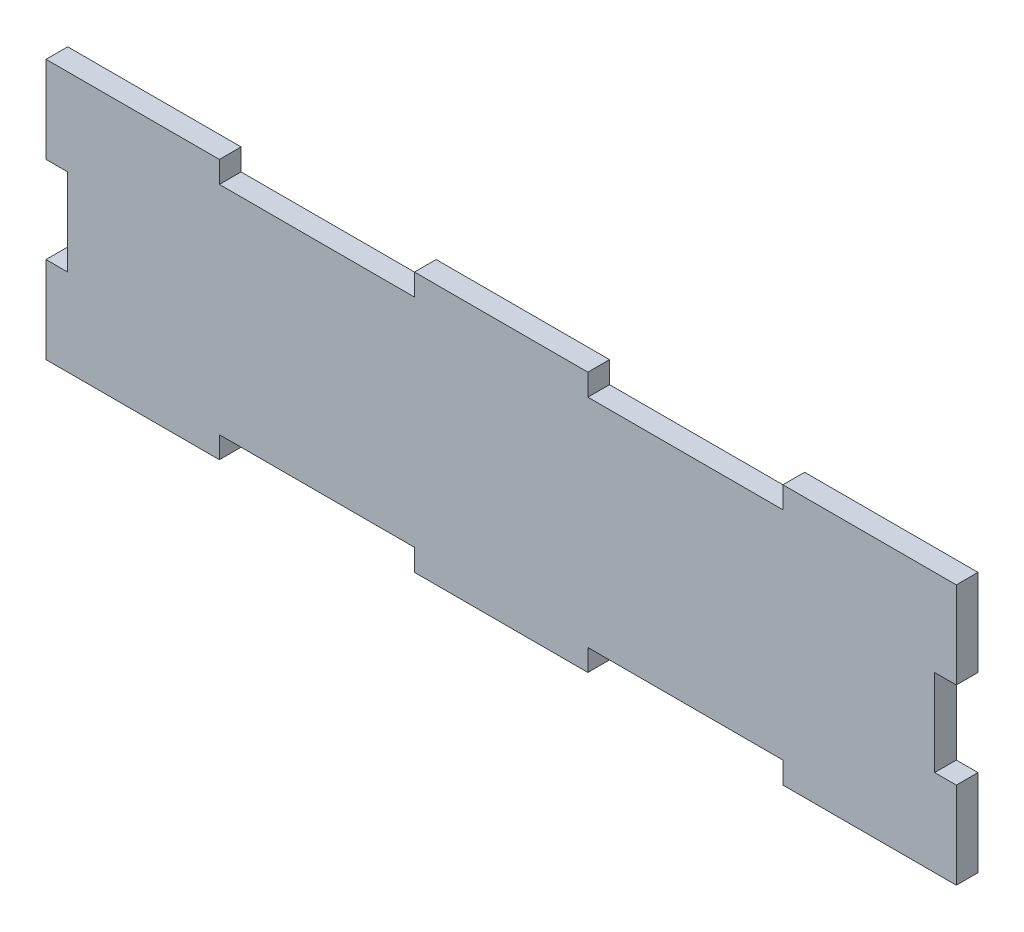
ISO-10303-21;
HEADER;
FILE_DESCRIPTION(('STEP AP214'),'2;1');
FILE_NAME('part.step','',(''),(''),'','','');
FILE_SCHEMA(('AUTOMOTIVE_DESIGN { 1 0 10303 214 1 1 1 1 }'));
ENDSEC;
DATA;
#1=APPLICATION_CONTEXT('core data for automotive mechanical design processes');
#2=APPLICATION_PROTOCOL_DEFINITION('international standard','automotive_design',2000,#1);
#3=PRODUCT_CONTEXT('',#1,'mechanical');
#4=PRODUCT('Part','Part','',(#3));
#5=PRODUCT_RELATED_PRODUCT_CATEGORY('part','',(#4));
#6=PRODUCT_DEFINITION_FORMATION('','',#4);
#7=PRODUCT_DEFINITION_CONTEXT('part definition',#1,'design');
#8=PRODUCT_DEFINITION('design','',#6,#7);
#9=PRODUCT_DEFINITION_SHAPE('','',#8);
#10=(LENGTH_UNIT() NAMED_UNIT(*) SI_UNIT(.MILLI.,.METRE.));
#11=(NAMED_UNIT(*) PLANE_ANGLE_UNIT() SI_UNIT($,.RADIAN.));
#12=(NAMED_UNIT(*) SI_UNIT($,.STERADIAN.) SOLID_ANGLE_UNIT());
#13=UNCERTAINTY_MEASURE_WITH_UNIT(LENGTH_MEASURE(1.E-05),#10,'distance_accuracy_value','');
#14=(GEOMETRIC_REPRESENTATION_CONTEXT(3) GLOBAL_UNCERTAINTY_ASSIGNED_CONTEXT((#13)) GLOBAL_UNIT_ASSIGNED_CONTEXT((#10,
#11,#12)) REPRESENTATION_CONTEXT('',''));
#15=CARTESIAN_POINT('',(0.,0.,0.));
#16=DIRECTION('',(0.,0.,1.));
#17=DIRECTION('',(1.,0.,0.));
#18=AXIS2_PLACEMENT_3D('',#15,#16,#17);
#19=CARTESIAN_POINT('',(133.35,38.1,3.175));
#20=DIRECTION('',(-1.,0.,0.));
#21=DIRECTION('',(0.,0.,1.));
#22=AXIS2_PLACEMENT_3D('',#19,#20,#21);
#23=PLANE('',#22);
#24=DIRECTION('',(0.,1.,0.));
#25=VECTOR('',#24,1.);
#26=CARTESIAN_POINT('',(133.35,38.1,3.175));
#27=LINE('',#26,#25);
#28=CARTESIAN_POINT('',(133.35,12.6999999999459,3.17500000000004));
#29=VERTEX_POINT('',#28);
#30=CARTESIAN_POINT('',(133.35,38.1,3.175));
#31=VERTEX_POINT('',#30);
#32=EDGE_CURVE('E370',#29,#31,#27,.T.);
#33=ORIENTED_EDGE('',*,*,#32,.F.);
#34=DIRECTION('',(0.,0.,-1.));
#35=VECTOR('',#34,1.);
#36=CARTESIAN_POINT('',(133.35,12.699999999946,-3.17499999999996));
#37=LINE('',#36,#35);
#38=CARTESIAN_POINT('',(133.35,12.699999999946,-3.17499999999996));
#39=VERTEX_POINT('',#38);
#40=EDGE_CURVE('E251',#29,#39,#37,.T.);
#41=ORIENTED_EDGE('',*,*,#40,.T.);
#42=DIRECTION('',(0.,1.,0.));
#43=VECTOR('',#42,1.);
#44=CARTESIAN_POINT('',(133.35,38.1,-3.175));
#45=LINE('',#44,#43);
#46=CARTESIAN_POINT('',(133.35,38.1,-3.175));
#47=VERTEX_POINT('',#46);
#48=EDGE_CURVE('E321',#39,#47,#45,.T.);
#49=ORIENTED_EDGE('',*,*,#48,.T.);
#50=DIRECTION('',(0.,0.,-1.));
#51=VECTOR('',#50,1.);
#52=CARTESIAN_POINT('',(133.35,38.1,3.175));
#53=LINE('',#52,#51);
#54=EDGE_CURVE('E406',#31,#47,#53,.T.);
#55=ORIENTED_EDGE('',*,*,#54,.F.);
#56=EDGE_LOOP('',(#33,#41,#49,#55));
#57=FACE_BOUND('',#56,.T.);
#58=ADVANCED_FACE('F36',(#57),#23,.F.);
#59=CARTESIAN_POINT('',(-133.35,38.1,3.175));
#60=DIRECTION('',(1.,0.,0.));
#61=DIRECTION('',(0.,1.,0.));
#62=AXIS2_PLACEMENT_3D('',#59,#60,#61);
#63=PLANE('',#62);
#64=DIRECTION('',(0.,-1.,0.));
#65=VECTOR('',#64,1.);
#66=CARTESIAN_POINT('',(-133.35,38.1,3.175));
#67=LINE('',#66,#65);
#68=CARTESIAN_POINT('',(-133.35,-12.7,3.17499999999928));
#69=VERTEX_POINT('',#68);
#70=CARTESIAN_POINT('',(-133.35,-38.1,3.175));
#71=VERTEX_POINT('',#70);
#72=EDGE_CURVE('E374',#69,#71,#67,.T.);
#73=ORIENTED_EDGE('',*,*,#72,.F.);
#74=DIRECTION('',(0.,0.,-1.));
#75=VECTOR('',#74,1.);
#76=CARTESIAN_POINT('',(-133.35,-12.7,-3.17500000000072));
#77=LINE('',#76,#75);
#78=CARTESIAN_POINT('',(-133.35,-12.7,-3.17500000000072));
#79=VERTEX_POINT('',#78);
#80=EDGE_CURVE('E227',#69,#79,#77,.T.);
#81=ORIENTED_EDGE('',*,*,#80,.T.);
#82=DIRECTION('',(0.,-1.,0.));
#83=VECTOR('',#82,1.);
#84=CARTESIAN_POINT('',(-133.35,38.1,-3.175));
#85=LINE('',#84,#83);
#86=CARTESIAN_POINT('',(-133.35,-38.1,-3.175));
#87=VERTEX_POINT('',#86);
#88=EDGE_CURVE('E389',#79,#87,#85,.T.);
#89=ORIENTED_EDGE('',*,*,#88,.T.);
#90=DIRECTION('',(0.,0.,-1.));
#91=VECTOR('',#90,1.);
#92=CARTESIAN_POINT('',(-133.35,-38.1,3.175));
#93=LINE('',#92,#91);
#94=EDGE_CURVE('E400',#71,#87,#93,.T.);
#95=ORIENTED_EDGE('',*,*,#94,.F.);
#96=EDGE_LOOP('',(#73,#81,#89,#95));
#97=FACE_BOUND('',#96,.T.);
#98=ADVANCED_FACE('F471',(#97),#63,.F.);
#99=CARTESIAN_POINT('',(0.,0.,3.175));
#100=DIRECTION('',(0.,0.,1.));
#101=DIRECTION('',(1.,0.,0.));
#102=AXIS2_PLACEMENT_3D('',#99,#100,#101);
#103=PLANE('',#102);
#104=DIRECTION('',(0.,-1.,0.));
#105=VECTOR('',#104,1.);
#106=CARTESIAN_POINT('',(-127.,12.7,3.17499999999939));
#107=LINE('',#106,#105);
#108=CARTESIAN_POINT('',(-127.,12.7,3.17499999999939));
#109=VERTEX_POINT('',#108);
#110=CARTESIAN_POINT('',(-127.,-12.7,3.1749999999993));
#111=VERTEX_POINT('',#110);
#112=EDGE_CURVE('E226',#109,#111,#107,.T.);
#113=ORIENTED_EDGE('',*,*,#112,.T.);
#114=DIRECTION('',(-1.,0.,0.));
#115=VECTOR('',#114,1.);
#116=CARTESIAN_POINT('',(-127.,-12.7,3.1749999999993));
#117=LINE('',#116,#115);
#118=EDGE_CURVE('E241',#111,#69,#117,.T.);
#119=ORIENTED_EDGE('',*,*,#118,.T.);
#120=ORIENTED_EDGE('',*,*,#72,.T.);
#121=DIRECTION('',(1.,0.,0.));
#122=VECTOR('',#121,1.);
#123=CARTESIAN_POINT('',(-133.35,-38.1,3.175));
#124=LINE('',#123,#122);
#125=CARTESIAN_POINT('',(-82.55,-38.1,3.17500000000013));
#126=VERTEX_POINT('',#125);
#127=EDGE_CURVE('E378',#71,#126,#124,.T.);
#128=ORIENTED_EDGE('',*,*,#127,.T.);
#129=DIRECTION('',(0.,-1.,0.));
#130=VECTOR('',#129,1.);
#131=CARTESIAN_POINT('',(-82.55,-31.75,3.17500000000011));
#132=LINE('',#131,#130);
#133=CARTESIAN_POINT('',(-82.55,-31.75,3.17500000000011));
#134=VERTEX_POINT('',#133);
#135=EDGE_CURVE('E362',#134,#126,#132,.T.);
#136=ORIENTED_EDGE('',*,*,#135,.F.);
#137=DIRECTION('',(-1.,0.,0.));
#138=VECTOR('',#137,1.);
#139=CARTESIAN_POINT('',(0.,-31.75,3.17500000000011));
#140=LINE('',#139,#138);
#141=CARTESIAN_POINT('',(-25.4,-31.75,3.17500000000011));
#142=VERTEX_POINT('',#141);
#143=EDGE_CURVE('E324',#142,#134,#140,.T.);
#144=ORIENTED_EDGE('',*,*,#143,.F.);
#145=DIRECTION('',(0.,-1.,0.));
#146=VECTOR('',#145,1.);
#147=CARTESIAN_POINT('',(-25.4,-31.75,3.17500000000011));
#148=LINE('',#147,#146);
#149=CARTESIAN_POINT('',(-25.4,-38.1,3.17500000000013));
#150=VERTEX_POINT('',#149);
#151=EDGE_CURVE('E359',#142,#150,#148,.T.);
#152=ORIENTED_EDGE('',*,*,#151,.T.);
#153=CARTESIAN_POINT('',(25.4,-38.1,3.17500000000013));
#154=VERTEX_POINT('',#153);
#155=EDGE_CURVE('E382',#150,#154,#124,.T.);
#156=ORIENTED_EDGE('',*,*,#155,.T.);
#157=DIRECTION('',(0.,-1.,0.));
#158=VECTOR('',#157,1.);
#159=CARTESIAN_POINT('',(25.4,-31.75,3.17500000000011));
#160=LINE('',#159,#158);
#161=CARTESIAN_POINT('',(25.4,-31.75,3.17500000000011));
#162=VERTEX_POINT('',#161);
#163=EDGE_CURVE('E352',#162,#154,#160,.T.);
#164=ORIENTED_EDGE('',*,*,#163,.F.);
#165=DIRECTION('',(1.,0.,0.));
#166=VECTOR('',#165,1.);
#167=CARTESIAN_POINT('',(0.,-31.75,3.17500000000011));
#168=LINE('',#167,#166);
#169=CARTESIAN_POINT('',(82.55,-31.75,3.17500000000011));
#170=VERTEX_POINT('',#169);
#171=EDGE_CURVE('E333',#162,#170,#168,.T.);
#172=ORIENTED_EDGE('',*,*,#171,.T.);
#173=DIRECTION('',(0.,-1.,0.));
#174=VECTOR('',#173,1.);
#175=CARTESIAN_POINT('',(82.55,-31.75,3.17500000000011));
#176=LINE('',#175,#174);
#177=CARTESIAN_POINT('',(82.55,-38.1,3.17500000000013));
#178=VERTEX_POINT('',#177);
#179=EDGE_CURVE('E349',#170,#178,#176,.T.);
#180=ORIENTED_EDGE('',*,*,#179,.T.);
#181=CARTESIAN_POINT('',(133.35,-38.1,3.175));
#182=VERTEX_POINT('',#181);
#183=EDGE_CURVE('E377',#178,#182,#124,.T.);
#184=ORIENTED_EDGE('',*,*,#183,.T.);
#185=CARTESIAN_POINT('',(133.35,-12.7000000000541,3.17499999999996));
#186=VERTEX_POINT('',#185);
#187=EDGE_CURVE('E366',#182,#186,#27,.T.);
#188=ORIENTED_EDGE('',*,*,#187,.T.);
#189=DIRECTION('',(1.,0.,0.));
#190=VECTOR('',#189,1.);
#191=CARTESIAN_POINT('',(127.,-12.700000000054,3.17499999999996));
#192=LINE('',#191,#190);
#193=CARTESIAN_POINT('',(127.,-12.700000000054,3.17499999999996));
#194=VERTEX_POINT('',#193);
#195=EDGE_CURVE('E267',#194,#186,#192,.T.);
#196=ORIENTED_EDGE('',*,*,#195,.F.);
#197=DIRECTION('',(0.,1.,0.));
#198=VECTOR('',#197,1.);
#199=CARTESIAN_POINT('',(127.,-12.700000000054,3.17499999999996));
#200=LINE('',#199,#198);
#201=CARTESIAN_POINT('',(127.,12.699999999946,3.17500000000004));
#202=VERTEX_POINT('',#201);
#203=EDGE_CURVE('E250',#194,#202,#200,.T.);
#204=ORIENTED_EDGE('',*,*,#203,.T.);
#205=DIRECTION('',(1.,0.,0.));
#206=VECTOR('',#205,1.);
#207=CARTESIAN_POINT('',(127.,12.699999999946,3.17500000000004));
#208=LINE('',#207,#206);
#209=EDGE_CURVE('E264',#202,#29,#208,.T.);
#210=ORIENTED_EDGE('',*,*,#209,.T.);
#211=ORIENTED_EDGE('',*,*,#32,.T.);
#212=DIRECTION('',(-1.,0.,0.));
#213=VECTOR('',#212,1.);
#214=CARTESIAN_POINT('',(-133.35,38.1,3.175));
#215=LINE('',#214,#213);
#216=CARTESIAN_POINT('',(82.55,38.1,3.17500000000013));
#217=VERTEX_POINT('',#216);
#218=EDGE_CURVE('E371',#31,#217,#215,.T.);
#219=ORIENTED_EDGE('',*,*,#218,.T.);
#220=DIRECTION('',(0.,-1.,0.));
#221=VECTOR('',#220,1.);
#222=CARTESIAN_POINT('',(82.55,38.1,3.17500000000013));
#223=LINE('',#222,#221);
#224=CARTESIAN_POINT('',(82.55,31.75,3.17500000000011));
#225=VERTEX_POINT('',#224);
#226=EDGE_CURVE('E303',#217,#225,#223,.T.);
#227=ORIENTED_EDGE('',*,*,#226,.T.);
#228=DIRECTION('',(1.,0.,0.));
#229=VECTOR('',#228,1.);
#230=CARTESIAN_POINT('',(0.,31.75,3.17500000000011));
#231=LINE('',#230,#229);
#232=CARTESIAN_POINT('',(25.4,31.75,3.17500000000011));
#233=VERTEX_POINT('',#232);
#234=EDGE_CURVE('E298',#233,#225,#231,.T.);
#235=ORIENTED_EDGE('',*,*,#234,.F.);
#236=DIRECTION('',(0.,-1.,0.));
#237=VECTOR('',#236,1.);
#238=CARTESIAN_POINT('',(25.4,38.1,3.17500000000013));
#239=LINE('',#238,#237);
#240=CARTESIAN_POINT('',(25.4,38.1,3.17500000000013));
#241=VERTEX_POINT('',#240);
#242=EDGE_CURVE('E306',#241,#233,#239,.T.);
#243=ORIENTED_EDGE('',*,*,#242,.F.);
#244=CARTESIAN_POINT('',(-25.4,38.1,3.17500000000013));
#245=VERTEX_POINT('',#244);
#246=EDGE_CURVE('E375',#241,#245,#215,.T.);
#247=ORIENTED_EDGE('',*,*,#246,.T.);
#248=DIRECTION('',(0.,-1.,0.));
#249=VECTOR('',#248,1.);
#250=CARTESIAN_POINT('',(-25.4,38.1,3.17500000000013));
#251=LINE('',#250,#249);
#252=CARTESIAN_POINT('',(-25.4,31.75,3.17500000000011));
#253=VERTEX_POINT('',#252);
#254=EDGE_CURVE('E313',#245,#253,#251,.T.);
#255=ORIENTED_EDGE('',*,*,#254,.T.);
#256=DIRECTION('',(-1.,0.,0.));
#257=VECTOR('',#256,1.);
#258=CARTESIAN_POINT('',(0.,31.75,3.17500000000011));
#259=LINE('',#258,#257);
#260=CARTESIAN_POINT('',(-82.55,31.75,3.17500000000011));
#261=VERTEX_POINT('',#260);
#262=EDGE_CURVE('E288',#253,#261,#259,.T.);
#263=ORIENTED_EDGE('',*,*,#262,.T.);
#264=DIRECTION('',(0.,-1.,0.));
#265=VECTOR('',#264,1.);
#266=CARTESIAN_POINT('',(-82.55,38.1,3.17500000000013));
#267=LINE('',#266,#265);
#268=CARTESIAN_POINT('',(-82.55,38.1,3.17500000000013));
#269=VERTEX_POINT('',#268);
#270=EDGE_CURVE('E316',#269,#261,#267,.T.);
#271=ORIENTED_EDGE('',*,*,#270,.F.);
#272=CARTESIAN_POINT('',(-133.35,38.1,3.175));
#273=VERTEX_POINT('',#272);
#274=EDGE_CURVE('E369',#269,#273,#215,.T.);
#275=ORIENTED_EDGE('',*,*,#274,.T.);
#276=CARTESIAN_POINT('',(-133.35,12.7,3.17499999999936));
#277=VERTEX_POINT('',#276);
#278=EDGE_CURVE('E240',#273,#277,#67,.T.);
#279=ORIENTED_EDGE('',*,*,#278,.T.);
#280=DIRECTION('',(-1.,0.,0.));
#281=VECTOR('',#280,1.);
#282=CARTESIAN_POINT('',(-127.,12.7,3.17499999999939));
#283=LINE('',#282,#281);
#284=EDGE_CURVE('E221',#109,#277,#283,.T.);
#285=ORIENTED_EDGE('',*,*,#284,.F.);
#286=EDGE_LOOP('',(#113,#119,#120,#128,#136,#144,#152,#156,#164,#172,#180,#184,#188,#196,#204,
#210,#211,#219,#227,#235,#243,#247,#255,#263,#271,#275,#279,#285));
#287=FACE_BOUND('',#286,.T.);
#288=ADVANCED_FACE('F238',(#287),#103,.T.);
#289=CARTESIAN_POINT('',(-133.35,38.1,3.175));
#290=DIRECTION('',(0.,-1.,0.));
#291=DIRECTION('',(0.,0.,-1.));
#292=AXIS2_PLACEMENT_3D('',#289,#290,#291);
#293=PLANE('',#292);
#294=DIRECTION('',(0.,0.,-1.));
#295=VECTOR('',#294,1.);
#296=CARTESIAN_POINT('',(-25.4,38.1,-6.34999999999987));
#297=LINE('',#296,#295);
#298=CARTESIAN_POINT('',(-25.4,38.1,-3.17499999999987));
#299=VERTEX_POINT('',#298);
#300=EDGE_CURVE('E276',#245,#299,#297,.T.);
#301=ORIENTED_EDGE('',*,*,#300,.F.);
#302=ORIENTED_EDGE('',*,*,#246,.F.);
#303=DIRECTION('',(0.,0.,-1.));
#304=VECTOR('',#303,1.);
#305=CARTESIAN_POINT('',(25.4,38.1,-6.34999999999987));
#306=LINE('',#305,#304);
#307=CARTESIAN_POINT('',(25.4,38.1,-3.17499999999987));
#308=VERTEX_POINT('',#307);
#309=EDGE_CURVE('E279',#241,#308,#306,.T.);
#310=ORIENTED_EDGE('',*,*,#309,.T.);
#311=DIRECTION('',(-1.,0.,0.));
#312=VECTOR('',#311,1.);
#313=CARTESIAN_POINT('',(-133.35,38.1,-3.175));
#314=LINE('',#313,#312);
#315=EDGE_CURVE('E390',#308,#299,#314,.T.);
#316=ORIENTED_EDGE('',*,*,#315,.T.);
#317=EDGE_LOOP('',(#301,#302,#310,#316));
#318=FACE_BOUND('',#317,.T.);
#319=ADVANCED_FACE('F486',(#318),#293,.F.);
#320=DIRECTION('',(0.,0.,-1.));
#321=VECTOR('',#320,1.);
#322=CARTESIAN_POINT('',(82.55,38.1,-6.34999999999987));
#323=LINE('',#322,#321);
#324=CARTESIAN_POINT('',(82.55,38.1,-3.17499999999986));
#325=VERTEX_POINT('',#324);
#326=EDGE_CURVE('E282',#217,#325,#323,.T.);
#327=ORIENTED_EDGE('',*,*,#326,.F.);
#328=ORIENTED_EDGE('',*,*,#218,.F.);
#329=ORIENTED_EDGE('',*,*,#54,.T.);
#330=EDGE_CURVE('E386',#47,#325,#314,.T.);
#331=ORIENTED_EDGE('',*,*,#330,.T.);
#332=EDGE_LOOP('',(#327,#328,#329,#331));
#333=FACE_BOUND('',#332,.T.);
#334=ADVANCED_FACE('F473',(#333),#293,.F.);
#335=CARTESIAN_POINT('',(-133.35,-38.1,3.175));
#336=DIRECTION('',(0.,1.,0.));
#337=DIRECTION('',(0.,0.,1.));
#338=AXIS2_PLACEMENT_3D('',#335,#336,#337);
#339=PLANE('',#338);
#340=DIRECTION('',(0.,0.,-1.));
#341=VECTOR('',#340,1.);
#342=CARTESIAN_POINT('',(25.4,-38.1,-6.34999999999987));
#343=LINE('',#342,#341);
#344=CARTESIAN_POINT('',(25.4,-38.1,-3.17499999999987));
#345=VERTEX_POINT('',#344);
#346=EDGE_CURVE('E344',#154,#345,#343,.T.);
#347=ORIENTED_EDGE('',*,*,#346,.F.);
#348=ORIENTED_EDGE('',*,*,#155,.F.);
#349=DIRECTION('',(0.,0.,-1.));
#350=VECTOR('',#349,1.);
#351=CARTESIAN_POINT('',(-25.4,-38.1,-6.34999999999987));
#352=LINE('',#351,#350);
#353=CARTESIAN_POINT('',(-25.4,-38.1,-3.17499999999987));
#354=VERTEX_POINT('',#353);
#355=EDGE_CURVE('E341',#150,#354,#352,.T.);
#356=ORIENTED_EDGE('',*,*,#355,.T.);
#357=DIRECTION('',(1.,0.,0.));
#358=VECTOR('',#357,1.);
#359=CARTESIAN_POINT('',(-133.35,-38.1,-3.175));
#360=LINE('',#359,#358);
#361=EDGE_CURVE('E397',#354,#345,#360,.T.);
#362=ORIENTED_EDGE('',*,*,#361,.T.);
#363=EDGE_LOOP('',(#347,#348,#356,#362));
#364=FACE_BOUND('',#363,.T.);
#365=ADVANCED_FACE('F445',(#364),#339,.F.);
#366=DIRECTION('',(0.,0.,-1.));
#367=VECTOR('',#366,1.);
#368=CARTESIAN_POINT('',(-82.55,-38.1,-6.34999999999987));
#369=LINE('',#368,#367);
#370=CARTESIAN_POINT('',(-82.55,-38.1,-3.17499999999986));
#371=VERTEX_POINT('',#370);
#372=EDGE_CURVE('E243',#126,#371,#369,.T.);
#373=ORIENTED_EDGE('',*,*,#372,.F.);
#374=ORIENTED_EDGE('',*,*,#127,.F.);
#375=ORIENTED_EDGE('',*,*,#94,.T.);
#376=EDGE_CURVE('E394',#87,#371,#360,.T.);
#377=ORIENTED_EDGE('',*,*,#376,.T.);
#378=EDGE_LOOP('',(#373,#374,#375,#377));
#379=FACE_BOUND('',#378,.T.);
#380=ADVANCED_FACE('F461',(#379),#339,.F.);
#381=CARTESIAN_POINT('',(133.35,-38.1,-3.175));
#382=VERTEX_POINT('',#381);
#383=CARTESIAN_POINT('',(133.35,-12.700000000054,-3.17500000000004));
#384=VERTEX_POINT('',#383);
#385=EDGE_CURVE('E383',#382,#384,#45,.T.);
#386=ORIENTED_EDGE('',*,*,#385,.T.);
#387=DIRECTION('',(0.,0.,1.));
#388=VECTOR('',#387,1.);
#389=CARTESIAN_POINT('',(133.35,-12.700000000054,-3.17500000000004));
#390=LINE('',#389,#388);
#391=EDGE_CURVE('E258',#384,#186,#390,.T.);
#392=ORIENTED_EDGE('',*,*,#391,.T.);
#393=ORIENTED_EDGE('',*,*,#187,.F.);
#394=DIRECTION('',(0.,0.,-1.));
#395=VECTOR('',#394,1.);
#396=CARTESIAN_POINT('',(133.35,-38.1,3.175));
#397=LINE('',#396,#395);
#398=EDGE_CURVE('E381',#182,#382,#397,.T.);
#399=ORIENTED_EDGE('',*,*,#398,.T.);
#400=EDGE_LOOP('',(#386,#392,#393,#399));
#401=FACE_BOUND('',#400,.T.);
#402=ADVANCED_FACE('F38',(#401),#23,.F.);
#403=ORIENTED_EDGE('',*,*,#274,.F.);
#404=DIRECTION('',(0.,0.,-1.));
#405=VECTOR('',#404,1.);
#406=CARTESIAN_POINT('',(-82.55,38.1,-6.34999999999987));
#407=LINE('',#406,#405);
#408=CARTESIAN_POINT('',(-82.55,38.1,-3.17499999999986));
#409=VERTEX_POINT('',#408);
#410=EDGE_CURVE('E273',#269,#409,#407,.T.);
#411=ORIENTED_EDGE('',*,*,#410,.T.);
#412=CARTESIAN_POINT('',(-133.35,38.1,-3.175));
#413=VERTEX_POINT('',#412);
#414=EDGE_CURVE('E385',#409,#413,#314,.T.);
#415=ORIENTED_EDGE('',*,*,#414,.T.);
#416=DIRECTION('',(0.,0.,-1.));
#417=VECTOR('',#416,1.);
#418=CARTESIAN_POINT('',(-133.35,38.1,3.175));
#419=LINE('',#418,#417);
#420=EDGE_CURVE('E403',#273,#413,#419,.T.);
#421=ORIENTED_EDGE('',*,*,#420,.F.);
#422=EDGE_LOOP('',(#403,#411,#415,#421));
#423=FACE_BOUND('',#422,.T.);
#424=ADVANCED_FACE('F468',(#423),#293,.F.);
#425=CARTESIAN_POINT('',(-133.35,12.7,-3.17500000000064));
#426=VERTEX_POINT('',#425);
#427=EDGE_CURVE('E391',#413,#426,#85,.T.);
#428=ORIENTED_EDGE('',*,*,#427,.T.);
#429=DIRECTION('',(0.,0.,1.));
#430=VECTOR('',#429,1.);
#431=CARTESIAN_POINT('',(-133.35,12.7,-3.17500000000064));
#432=LINE('',#431,#430);
#433=EDGE_CURVE('E272',#426,#277,#432,.T.);
#434=ORIENTED_EDGE('',*,*,#433,.T.);
#435=ORIENTED_EDGE('',*,*,#278,.F.);
#436=ORIENTED_EDGE('',*,*,#420,.T.);
#437=EDGE_LOOP('',(#428,#434,#435,#436));
#438=FACE_BOUND('',#437,.T.);
#439=ADVANCED_FACE('F459',(#438),#63,.F.);
#440=ORIENTED_EDGE('',*,*,#183,.F.);
#441=DIRECTION('',(0.,0.,-1.));
#442=VECTOR('',#441,1.);
#443=CARTESIAN_POINT('',(82.55,-38.1,-6.34999999999987));
#444=LINE('',#443,#442);
#445=CARTESIAN_POINT('',(82.55,-38.1,-3.17499999999986));
#446=VERTEX_POINT('',#445);
#447=EDGE_CURVE('E325',#178,#446,#444,.T.);
#448=ORIENTED_EDGE('',*,*,#447,.T.);
#449=EDGE_CURVE('E393',#446,#382,#360,.T.);
#450=ORIENTED_EDGE('',*,*,#449,.T.);
#451=ORIENTED_EDGE('',*,*,#398,.F.);
#452=EDGE_LOOP('',(#440,#448,#450,#451));
#453=FACE_BOUND('',#452,.T.);
#454=ADVANCED_FACE('F457',(#453),#339,.F.);
#455=CARTESIAN_POINT('',(0.,0.,-3.175));
#456=DIRECTION('',(0.,0.,1.));
#457=DIRECTION('',(1.,0.,0.));
#458=AXIS2_PLACEMENT_3D('',#455,#456,#457);
#459=PLANE('',#458);
#460=DIRECTION('',(-1.,0.,0.));
#461=VECTOR('',#460,1.);
#462=CARTESIAN_POINT('',(-127.,12.7,-3.17500000000061));
#463=LINE('',#462,#461);
#464=CARTESIAN_POINT('',(-127.,12.7,-3.175));
#465=VERTEX_POINT('',#464);
#466=EDGE_CURVE('E224',#465,#426,#463,.T.);
#467=ORIENTED_EDGE('',*,*,#466,.T.);
#468=ORIENTED_EDGE('',*,*,#427,.F.);
#469=ORIENTED_EDGE('',*,*,#414,.F.);
#470=DIRECTION('',(0.,-1.,0.));
#471=VECTOR('',#470,1.);
#472=CARTESIAN_POINT('',(-82.55,38.1,-3.17499999999986));
#473=LINE('',#472,#471);
#474=CARTESIAN_POINT('',(-82.55,31.75,-3.17499999999988));
#475=VERTEX_POINT('',#474);
#476=EDGE_CURVE('E318',#409,#475,#473,.T.);
#477=ORIENTED_EDGE('',*,*,#476,.T.);
#478=DIRECTION('',(-1.,0.,0.));
#479=VECTOR('',#478,1.);
#480=CARTESIAN_POINT('',(0.,31.75,-3.175));
#481=LINE('',#480,#479);
#482=CARTESIAN_POINT('',(-25.4,31.75,-3.175));
#483=VERTEX_POINT('',#482);
#484=EDGE_CURVE('E413',#483,#475,#481,.T.);
#485=ORIENTED_EDGE('',*,*,#484,.F.);
#486=DIRECTION('',(0.,-1.,0.));
#487=VECTOR('',#486,1.);
#488=CARTESIAN_POINT('',(-25.4,38.1,-3.17499999999987));
#489=LINE('',#488,#487);
#490=EDGE_CURVE('E311',#299,#483,#489,.T.);
#491=ORIENTED_EDGE('',*,*,#490,.F.);
#492=ORIENTED_EDGE('',*,*,#315,.F.);
#493=DIRECTION('',(0.,-1.,0.));
#494=VECTOR('',#493,1.);
#495=CARTESIAN_POINT('',(25.4,38.1,-3.17499999999987));
#496=LINE('',#495,#494);
#497=CARTESIAN_POINT('',(25.4,31.75,-3.17499999999989));
#498=VERTEX_POINT('',#497);
#499=EDGE_CURVE('E308',#308,#498,#496,.T.);
#500=ORIENTED_EDGE('',*,*,#499,.T.);
#501=CARTESIAN_POINT('',(82.55,31.75,-3.175));
#502=VERTEX_POINT('',#501);
#503=EDGE_CURVE('E414',#502,#498,#481,.T.);
#504=ORIENTED_EDGE('',*,*,#503,.F.);
#505=DIRECTION('',(0.,-1.,0.));
#506=VECTOR('',#505,1.);
#507=CARTESIAN_POINT('',(82.55,38.1,-3.17499999999986));
#508=LINE('',#507,#506);
#509=EDGE_CURVE('E284',#325,#502,#508,.T.);
#510=ORIENTED_EDGE('',*,*,#509,.F.);
#511=ORIENTED_EDGE('',*,*,#330,.F.);
#512=ORIENTED_EDGE('',*,*,#48,.F.);
#513=DIRECTION('',(1.,0.,0.));
#514=VECTOR('',#513,1.);
#515=CARTESIAN_POINT('',(127.,12.699999999946,-3.17499999999996));
#516=LINE('',#515,#514);
#517=CARTESIAN_POINT('',(127.,12.699999999946,-3.17499999999996));
#518=VERTEX_POINT('',#517);
#519=EDGE_CURVE('E257',#518,#39,#516,.T.);
#520=ORIENTED_EDGE('',*,*,#519,.F.);
#521=DIRECTION('',(0.,1.,0.));
#522=VECTOR('',#521,1.);
#523=CARTESIAN_POINT('',(127.,-1.33025439009923E-12,-3.175));
#524=LINE('',#523,#522);
#525=CARTESIAN_POINT('',(127.,-12.700000000054,-3.175));
#526=VERTEX_POINT('',#525);
#527=EDGE_CURVE('E44',#526,#518,#524,.T.);
#528=ORIENTED_EDGE('',*,*,#527,.F.);
#529=DIRECTION('',(1.,0.,0.));
#530=VECTOR('',#529,1.);
#531=CARTESIAN_POINT('',(127.,-12.700000000054,-3.17500000000004));
#532=LINE('',#531,#530);
#533=EDGE_CURVE('E269',#526,#384,#532,.T.);
#534=ORIENTED_EDGE('',*,*,#533,.T.);
#535=ORIENTED_EDGE('',*,*,#385,.F.);
#536=ORIENTED_EDGE('',*,*,#449,.F.);
#537=DIRECTION('',(0.,-1.,0.));
#538=VECTOR('',#537,1.);
#539=CARTESIAN_POINT('',(82.55,-31.75,-3.17499999999988));
#540=LINE('',#539,#538);
#541=CARTESIAN_POINT('',(82.55,-31.75,-3.17499999999988));
#542=VERTEX_POINT('',#541);
#543=EDGE_CURVE('E339',#542,#446,#540,.T.);
#544=ORIENTED_EDGE('',*,*,#543,.F.);
#545=DIRECTION('',(-1.,0.,0.));
#546=VECTOR('',#545,1.);
#547=CARTESIAN_POINT('',(0.,-31.75,-3.175));
#548=LINE('',#547,#546);
#549=CARTESIAN_POINT('',(25.4,-31.75,-3.175));
#550=VERTEX_POINT('',#549);
#551=EDGE_CURVE('E410',#542,#550,#548,.T.);
#552=ORIENTED_EDGE('',*,*,#551,.T.);
#553=DIRECTION('',(0.,-1.,0.));
#554=VECTOR('',#553,1.);
#555=CARTESIAN_POINT('',(25.4,-31.75,-3.17499999999989));
#556=LINE('',#555,#554);
#557=EDGE_CURVE('E354',#550,#345,#556,.T.);
#558=ORIENTED_EDGE('',*,*,#557,.T.);
#559=ORIENTED_EDGE('',*,*,#361,.F.);
#560=DIRECTION('',(0.,-1.,0.));
#561=VECTOR('',#560,1.);
#562=CARTESIAN_POINT('',(-25.4,-31.75,-3.17499999999989));
#563=LINE('',#562,#561);
#564=CARTESIAN_POINT('',(-25.4,-31.75,-3.17499999999989));
#565=VERTEX_POINT('',#564);
#566=EDGE_CURVE('E357',#565,#354,#563,.T.);
#567=ORIENTED_EDGE('',*,*,#566,.F.);
#568=CARTESIAN_POINT('',(-82.55,-31.75,-3.175));
#569=VERTEX_POINT('',#568);
#570=EDGE_CURVE('E409',#565,#569,#548,.T.);
#571=ORIENTED_EDGE('',*,*,#570,.T.);
#572=DIRECTION('',(0.,-1.,0.));
#573=VECTOR('',#572,1.);
#574=CARTESIAN_POINT('',(-82.55,-31.75,-3.17499999999988));
#575=LINE('',#574,#573);
#576=EDGE_CURVE('E289',#569,#371,#575,.T.);
#577=ORIENTED_EDGE('',*,*,#576,.T.);
#578=ORIENTED_EDGE('',*,*,#376,.F.);
#579=ORIENTED_EDGE('',*,*,#88,.F.);
#580=DIRECTION('',(-1.,0.,0.));
#581=VECTOR('',#580,1.);
#582=CARTESIAN_POINT('',(-127.,-12.7,-3.17500000000069));
#583=LINE('',#582,#581);
#584=CARTESIAN_POINT('',(-127.,-12.7,-3.17500000000069));
#585=VERTEX_POINT('',#584);
#586=EDGE_CURVE('E245',#585,#79,#583,.T.);
#587=ORIENTED_EDGE('',*,*,#586,.F.);
#588=DIRECTION('',(0.,-1.,0.));
#589=VECTOR('',#588,1.);
#590=CARTESIAN_POINT('',(-127.,0.,-3.175));
#591=LINE('',#590,#589);
#592=EDGE_CURVE('E11',#465,#585,#591,.T.);
#593=ORIENTED_EDGE('',*,*,#592,.F.);
#594=EDGE_LOOP('',(#467,#468,#469,#477,#485,#491,#492,#500,#504,#510,#511,#512,#520,#528,#534,
#535,#536,#544,#552,#558,#559,#567,#571,#577,#578,#579,#587,#593));
#595=FACE_BOUND('',#594,.T.);
#596=ADVANCED_FACE('F423',(#595),#459,.F.);
#597=CARTESIAN_POINT('',(0.,-31.75,-6.34999999999989));
#598=DIRECTION('',(0.,1.,0.));
#599=DIRECTION('',(1.,0.,0.));
#600=AXIS2_PLACEMENT_3D('',#597,#598,#599);
#601=PLANE('',#600);
#602=DIRECTION('',(0.,0.,-1.));
#603=VECTOR('',#602,1.);
#604=CARTESIAN_POINT('',(-25.4,-31.75,-6.34999999999989));
#605=LINE('',#604,#603);
#606=EDGE_CURVE('E328',#142,#565,#605,.T.);
#607=ORIENTED_EDGE('',*,*,#606,.F.);
#608=ORIENTED_EDGE('',*,*,#143,.T.);
#609=DIRECTION('',(0.,0.,-1.));
#610=VECTOR('',#609,1.);
#611=CARTESIAN_POINT('',(-82.55,-31.75,-6.34999999999989));
#612=LINE('',#611,#610);
#613=EDGE_CURVE('E322',#134,#569,#612,.T.);
#614=ORIENTED_EDGE('',*,*,#613,.T.);
#615=ORIENTED_EDGE('',*,*,#570,.F.);
#616=EDGE_LOOP('',(#607,#608,#614,#615));
#617=FACE_BOUND('',#616,.T.);
#618=ADVANCED_FACE('F466',(#617),#601,.F.);
#619=CARTESIAN_POINT('',(-25.4,-31.75,-6.34999999999989));
#620=DIRECTION('',(-1.,0.,0.));
#621=DIRECTION('',(0.,1.,0.));
#622=AXIS2_PLACEMENT_3D('',#619,#620,#621);
#623=PLANE('',#622);
#624=ORIENTED_EDGE('',*,*,#355,.F.);
#625=ORIENTED_EDGE('',*,*,#151,.F.);
#626=ORIENTED_EDGE('',*,*,#606,.T.);
#627=ORIENTED_EDGE('',*,*,#566,.T.);
#628=EDGE_LOOP('',(#624,#625,#626,#627));
#629=FACE_BOUND('',#628,.T.);
#630=ADVANCED_FACE('F538',(#629),#623,.T.);
#631=CARTESIAN_POINT('',(-82.55,-31.75,-6.34999999999989));
#632=DIRECTION('',(-1.,0.,0.));
#633=DIRECTION('',(0.,1.,0.));
#634=AXIS2_PLACEMENT_3D('',#631,#632,#633);
#635=PLANE('',#634);
#636=ORIENTED_EDGE('',*,*,#372,.T.);
#637=ORIENTED_EDGE('',*,*,#576,.F.);
#638=ORIENTED_EDGE('',*,*,#613,.F.);
#639=ORIENTED_EDGE('',*,*,#135,.T.);
#640=EDGE_LOOP('',(#636,#637,#638,#639));
#641=FACE_BOUND('',#640,.T.);
#642=ADVANCED_FACE('F533',(#641),#635,.F.);
#643=DIRECTION('',(0.,0.,-1.));
#644=VECTOR('',#643,1.);
#645=CARTESIAN_POINT('',(82.55,-31.75,-6.34999999999989));
#646=LINE('',#645,#644);
#647=EDGE_CURVE('E336',#170,#542,#646,.T.);
#648=ORIENTED_EDGE('',*,*,#647,.F.);
#649=ORIENTED_EDGE('',*,*,#171,.F.);
#650=DIRECTION('',(0.,0.,-1.));
#651=VECTOR('',#650,1.);
#652=CARTESIAN_POINT('',(25.4,-31.75,-6.34999999999989));
#653=LINE('',#652,#651);
#654=EDGE_CURVE('E331',#162,#550,#653,.T.);
#655=ORIENTED_EDGE('',*,*,#654,.T.);
#656=ORIENTED_EDGE('',*,*,#551,.F.);
#657=EDGE_LOOP('',(#648,#649,#655,#656));
#658=FACE_BOUND('',#657,.T.);
#659=ADVANCED_FACE('F545',(#658),#601,.F.);
#660=CARTESIAN_POINT('',(25.4,-31.75,-6.34999999999989));
#661=DIRECTION('',(-1.,0.,0.));
#662=DIRECTION('',(0.,1.,0.));
#663=AXIS2_PLACEMENT_3D('',#660,#661,#662);
#664=PLANE('',#663);
#665=ORIENTED_EDGE('',*,*,#346,.T.);
#666=ORIENTED_EDGE('',*,*,#557,.F.);
#667=ORIENTED_EDGE('',*,*,#654,.F.);
#668=ORIENTED_EDGE('',*,*,#163,.T.);
#669=EDGE_LOOP('',(#665,#666,#667,#668));
#670=FACE_BOUND('',#669,.T.);
#671=ADVANCED_FACE('F453',(#670),#664,.F.);
#672=CARTESIAN_POINT('',(82.55,-31.75,-6.34999999999989));
#673=DIRECTION('',(-1.,0.,0.));
#674=DIRECTION('',(0.,1.,0.));
#675=AXIS2_PLACEMENT_3D('',#672,#673,#674);
#676=PLANE('',#675);
#677=ORIENTED_EDGE('',*,*,#447,.F.);
#678=ORIENTED_EDGE('',*,*,#179,.F.);
#679=ORIENTED_EDGE('',*,*,#647,.T.);
#680=ORIENTED_EDGE('',*,*,#543,.T.);
#681=EDGE_LOOP('',(#677,#678,#679,#680));
#682=FACE_BOUND('',#681,.T.);
#683=ADVANCED_FACE('F622',(#682),#676,.T.);
#684=CARTESIAN_POINT('',(0.,31.75,-6.34999999999989));
#685=DIRECTION('',(0.,1.,0.));
#686=DIRECTION('',(1.,0.,0.));
#687=AXIS2_PLACEMENT_3D('',#684,#685,#686);
#688=PLANE('',#687);
#689=ORIENTED_EDGE('',*,*,#484,.T.);
#690=DIRECTION('',(0.,0.,-1.));
#691=VECTOR('',#690,1.);
#692=CARTESIAN_POINT('',(-82.55,31.75,-6.34999999999989));
#693=LINE('',#692,#691);
#694=EDGE_CURVE('E285',#261,#475,#693,.T.);
#695=ORIENTED_EDGE('',*,*,#694,.F.);
#696=ORIENTED_EDGE('',*,*,#262,.F.);
#697=DIRECTION('',(0.,0.,-1.));
#698=VECTOR('',#697,1.);
#699=CARTESIAN_POINT('',(-25.4,31.75,-6.34999999999989));
#700=LINE('',#699,#698);
#701=EDGE_CURVE('E292',#253,#483,#700,.T.);
#702=ORIENTED_EDGE('',*,*,#701,.T.);
#703=EDGE_LOOP('',(#689,#695,#696,#702));
#704=FACE_BOUND('',#703,.T.);
#705=ADVANCED_FACE('F630',(#704),#688,.T.);
#706=CARTESIAN_POINT('',(-25.4,38.1,-6.34999999999987));
#707=DIRECTION('',(-1.,0.,0.));
#708=DIRECTION('',(0.,1.,0.));
#709=AXIS2_PLACEMENT_3D('',#706,#707,#708);
#710=PLANE('',#709);
#711=ORIENTED_EDGE('',*,*,#701,.F.);
#712=ORIENTED_EDGE('',*,*,#254,.F.);
#713=ORIENTED_EDGE('',*,*,#300,.T.);
#714=ORIENTED_EDGE('',*,*,#490,.T.);
#715=EDGE_LOOP('',(#711,#712,#713,#714));
#716=FACE_BOUND('',#715,.T.);
#717=ADVANCED_FACE('F640',(#716),#710,.T.);
#718=CARTESIAN_POINT('',(-82.55,38.1,-6.34999999999987));
#719=DIRECTION('',(-1.,0.,0.));
#720=DIRECTION('',(0.,1.,0.));
#721=AXIS2_PLACEMENT_3D('',#718,#719,#720);
#722=PLANE('',#721);
#723=ORIENTED_EDGE('',*,*,#694,.T.);
#724=ORIENTED_EDGE('',*,*,#476,.F.);
#725=ORIENTED_EDGE('',*,*,#410,.F.);
#726=ORIENTED_EDGE('',*,*,#270,.T.);
#727=EDGE_LOOP('',(#723,#724,#725,#726));
#728=FACE_BOUND('',#727,.T.);
#729=ADVANCED_FACE('F650',(#728),#722,.F.);
#730=ORIENTED_EDGE('',*,*,#503,.T.);
#731=DIRECTION('',(0.,0.,-1.));
#732=VECTOR('',#731,1.);
#733=CARTESIAN_POINT('',(25.4,31.75,-6.34999999999989));
#734=LINE('',#733,#732);
#735=EDGE_CURVE('E295',#233,#498,#734,.T.);
#736=ORIENTED_EDGE('',*,*,#735,.F.);
#737=ORIENTED_EDGE('',*,*,#234,.T.);
#738=DIRECTION('',(0.,0.,-1.));
#739=VECTOR('',#738,1.);
#740=CARTESIAN_POINT('',(82.55,31.75,-6.34999999999989));
#741=LINE('',#740,#739);
#742=EDGE_CURVE('E277',#225,#502,#741,.T.);
#743=ORIENTED_EDGE('',*,*,#742,.T.);
#744=EDGE_LOOP('',(#730,#736,#737,#743));
#745=FACE_BOUND('',#744,.T.);
#746=ADVANCED_FACE('F504',(#745),#688,.T.);
#747=CARTESIAN_POINT('',(25.4,38.1,-6.34999999999987));
#748=DIRECTION('',(-1.,0.,0.));
#749=DIRECTION('',(0.,1.,0.));
#750=AXIS2_PLACEMENT_3D('',#747,#748,#749);
#751=PLANE('',#750);
#752=ORIENTED_EDGE('',*,*,#735,.T.);
#753=ORIENTED_EDGE('',*,*,#499,.F.);
#754=ORIENTED_EDGE('',*,*,#309,.F.);
#755=ORIENTED_EDGE('',*,*,#242,.T.);
#756=EDGE_LOOP('',(#752,#753,#754,#755));
#757=FACE_BOUND('',#756,.T.);
#758=ADVANCED_FACE('F510',(#757),#751,.F.);
#759=CARTESIAN_POINT('',(82.55,38.1,-6.34999999999987));
#760=DIRECTION('',(-1.,0.,0.));
#761=DIRECTION('',(0.,1.,0.));
#762=AXIS2_PLACEMENT_3D('',#759,#760,#761);
#763=PLANE('',#762);
#764=ORIENTED_EDGE('',*,*,#742,.F.);
#765=ORIENTED_EDGE('',*,*,#226,.F.);
#766=ORIENTED_EDGE('',*,*,#326,.T.);
#767=ORIENTED_EDGE('',*,*,#509,.T.);
#768=EDGE_LOOP('',(#764,#765,#766,#767));
#769=FACE_BOUND('',#768,.T.);
#770=ADVANCED_FACE('F501',(#769),#763,.T.);
#771=CARTESIAN_POINT('',(127.,-5.37665901624541E-11,-63.5));
#772=DIRECTION('',(1.,0.,0.));
#773=DIRECTION('',(0.,-1.,0.));
#774=AXIS2_PLACEMENT_3D('',#771,#772,#773);
#775=PLANE('',#774);
#776=ORIENTED_EDGE('',*,*,#527,.T.);
#777=DIRECTION('',(0.,0.,-1.));
#778=VECTOR('',#777,1.);
#779=CARTESIAN_POINT('',(127.,12.699999999946,-3.17499999999996));
#780=LINE('',#779,#778);
#781=EDGE_CURVE('E254',#202,#518,#780,.T.);
#782=ORIENTED_EDGE('',*,*,#781,.F.);
#783=ORIENTED_EDGE('',*,*,#203,.F.);
#784=DIRECTION('',(0.,0.,1.));
#785=VECTOR('',#784,1.);
#786=CARTESIAN_POINT('',(127.,-12.700000000054,-3.17500000000004));
#787=LINE('',#786,#785);
#788=EDGE_CURVE('E58',#526,#194,#787,.T.);
#789=ORIENTED_EDGE('',*,*,#788,.F.);
#790=EDGE_LOOP('',(#776,#782,#783,#789));
#791=FACE_BOUND('',#790,.T.);
#792=ADVANCED_FACE('F417',(#791),#775,.T.);
#793=CARTESIAN_POINT('',(127.,-12.700000000054,-3.17500000000004));
#794=DIRECTION('',(0.,1.,0.));
#795=DIRECTION('',(1.,0.,0.));
#796=AXIS2_PLACEMENT_3D('',#793,#794,#795);
#797=PLANE('',#796);
#798=ORIENTED_EDGE('',*,*,#391,.F.);
#799=ORIENTED_EDGE('',*,*,#533,.F.);
#800=ORIENTED_EDGE('',*,*,#788,.T.);
#801=ORIENTED_EDGE('',*,*,#195,.T.);
#802=EDGE_LOOP('',(#798,#799,#800,#801));
#803=FACE_BOUND('',#802,.T.);
#804=ADVANCED_FACE('F434',(#803),#797,.T.);
#805=CARTESIAN_POINT('',(127.,12.699999999946,-3.17499999999996));
#806=DIRECTION('',(0.,-1.,0.));
#807=DIRECTION('',(-1.,0.,0.));
#808=AXIS2_PLACEMENT_3D('',#805,#806,#807);
#809=PLANE('',#808);
#810=ORIENTED_EDGE('',*,*,#40,.F.);
#811=ORIENTED_EDGE('',*,*,#209,.F.);
#812=ORIENTED_EDGE('',*,*,#781,.T.);
#813=ORIENTED_EDGE('',*,*,#519,.T.);
#814=EDGE_LOOP('',(#810,#811,#812,#813));
#815=FACE_BOUND('',#814,.T.);
#816=ADVANCED_FACE('F421',(#815),#809,.T.);
#817=CARTESIAN_POINT('',(-127.,2.28983498828939E-13,-63.5000000000007));
#818=DIRECTION('',(-1.,0.,0.));
#819=DIRECTION('',(0.,1.,0.));
#820=AXIS2_PLACEMENT_3D('',#817,#818,#819);
#821=PLANE('',#820);
#822=ORIENTED_EDGE('',*,*,#592,.T.);
#823=DIRECTION('',(0.,0.,-1.));
#824=VECTOR('',#823,1.);
#825=CARTESIAN_POINT('',(-127.,-12.7,-3.17500000000069));
#826=LINE('',#825,#824);
#827=EDGE_CURVE('E233',#111,#585,#826,.T.);
#828=ORIENTED_EDGE('',*,*,#827,.F.);
#829=ORIENTED_EDGE('',*,*,#112,.F.);
#830=DIRECTION('',(0.,0.,1.));
#831=VECTOR('',#830,1.);
#832=CARTESIAN_POINT('',(-127.,12.7,-3.17500000000061));
#833=LINE('',#832,#831);
#834=EDGE_CURVE('E50',#465,#109,#833,.T.);
#835=ORIENTED_EDGE('',*,*,#834,.F.);
#836=EDGE_LOOP('',(#822,#828,#829,#835));
#837=FACE_BOUND('',#836,.T.);
#838=ADVANCED_FACE('F231',(#837),#821,.T.);
#839=CARTESIAN_POINT('',(-127.,12.7,-3.17500000000061));
#840=DIRECTION('',(0.,-1.,0.));
#841=DIRECTION('',(-1.,0.,0.));
#842=AXIS2_PLACEMENT_3D('',#839,#840,#841);
#843=PLANE('',#842);
#844=ORIENTED_EDGE('',*,*,#433,.F.);
#845=ORIENTED_EDGE('',*,*,#466,.F.);
#846=ORIENTED_EDGE('',*,*,#834,.T.);
#847=ORIENTED_EDGE('',*,*,#284,.T.);
#848=EDGE_LOOP('',(#844,#845,#846,#847));
#849=FACE_BOUND('',#848,.T.);
#850=ADVANCED_FACE('F219',(#849),#843,.T.);
#851=CARTESIAN_POINT('',(-127.,-12.7,-3.17500000000069));
#852=DIRECTION('',(0.,1.,0.));
#853=DIRECTION('',(1.,0.,0.));
#854=AXIS2_PLACEMENT_3D('',#851,#852,#853);
#855=PLANE('',#854);
#856=ORIENTED_EDGE('',*,*,#80,.F.);
#857=ORIENTED_EDGE('',*,*,#118,.F.);
#858=ORIENTED_EDGE('',*,*,#827,.T.);
#859=ORIENTED_EDGE('',*,*,#586,.T.);
#860=EDGE_LOOP('',(#856,#857,#858,#859));
#861=FACE_BOUND('',#860,.T.);
#862=ADVANCED_FACE('F524',(#861),#855,.T.);
#863=CLOSED_SHELL('',(#58,#98,#288,#319,#334,#365,#380,#402,#424,#439,#454,#596,#618,#630,#642,
#659,#671,#683,#705,#717,#729,#746,#758,#770,#792,#804,#816,#838,#850,#862));
#864=MANIFOLD_SOLID_BREP('B2',#863);
#865=ADVANCED_BREP_SHAPE_REPRESENTATION('',(#18,#864),#14);
#866=SHAPE_DEFINITION_REPRESENTATION(#9,#865);
ENDSEC;
END-ISO-10303-21;
